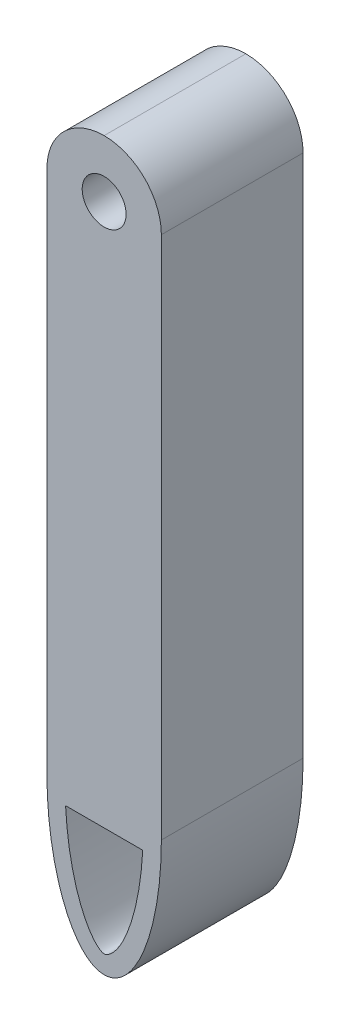
ISO-10303-21;
HEADER;
FILE_DESCRIPTION(('STEP AP214'),'2;1');
FILE_NAME('part.step','',(''),(''),'','','');
FILE_SCHEMA(('AUTOMOTIVE_DESIGN { 1 0 10303 214 1 1 1 1 }'));
ENDSEC;
DATA;
#1=APPLICATION_CONTEXT('core data for automotive mechanical design processes');
#2=APPLICATION_PROTOCOL_DEFINITION('international standard','automotive_design',2000,#1);
#3=PRODUCT_CONTEXT('',#1,'mechanical');
#4=PRODUCT('Part','Part','',(#3));
#5=PRODUCT_RELATED_PRODUCT_CATEGORY('part','',(#4));
#6=PRODUCT_DEFINITION_FORMATION('','',#4);
#7=PRODUCT_DEFINITION_CONTEXT('part definition',#1,'design');
#8=PRODUCT_DEFINITION('design','',#6,#7);
#9=PRODUCT_DEFINITION_SHAPE('','',#8);
#10=(LENGTH_UNIT() NAMED_UNIT(*) SI_UNIT(.MILLI.,.METRE.));
#11=(NAMED_UNIT(*) PLANE_ANGLE_UNIT() SI_UNIT($,.RADIAN.));
#12=(NAMED_UNIT(*) SI_UNIT($,.STERADIAN.) SOLID_ANGLE_UNIT());
#13=UNCERTAINTY_MEASURE_WITH_UNIT(LENGTH_MEASURE(1.E-05),#10,'distance_accuracy_value','');
#14=(GEOMETRIC_REPRESENTATION_CONTEXT(3) GLOBAL_UNCERTAINTY_ASSIGNED_CONTEXT((#13)) GLOBAL_UNIT_ASSIGNED_CONTEXT((#10,
#11,#12)) REPRESENTATION_CONTEXT('',''));
#15=CARTESIAN_POINT('',(0.,0.,0.));
#16=DIRECTION('',(0.,0.,1.));
#17=DIRECTION('',(1.,0.,0.));
#18=AXIS2_PLACEMENT_3D('',#15,#16,#17);
#19=CARTESIAN_POINT('',(0.,0.,49.53));
#20=DIRECTION('',(1.,0.,0.));
#21=DIRECTION('',(0.,0.,-1.));
#22=AXIS2_PLACEMENT_3D('',#19,#20,#21);
#23=PLANE('',#22);
#24=DIRECTION('',(0.,-1.,0.));
#25=VECTOR('',#24,1.);
#26=CARTESIAN_POINT('',(0.,0.,49.53));
#27=LINE('',#26,#25);
#28=CARTESIAN_POINT('',(0.,183.2,49.53));
#29=VERTEX_POINT('',#28);
#30=CARTESIAN_POINT('',(0.,0.,49.53));
#31=VERTEX_POINT('',#30);
#32=EDGE_CURVE('E140',#29,#31,#27,.T.);
#33=ORIENTED_EDGE('',*,*,#32,.F.);
#34=DIRECTION('',(0.,0.,-1.));
#35=VECTOR('',#34,1.);
#36=CARTESIAN_POINT('',(0.,183.2,49.53));
#37=LINE('',#36,#35);
#38=CARTESIAN_POINT('',(0.,183.2,0.));
#39=VERTEX_POINT('',#38);
#40=EDGE_CURVE('E11',#29,#39,#37,.T.);
#41=ORIENTED_EDGE('',*,*,#40,.T.);
#42=DIRECTION('',(0.,-1.,0.));
#43=VECTOR('',#42,1.);
#44=CARTESIAN_POINT('',(0.,0.,0.));
#45=LINE('',#44,#43);
#46=CARTESIAN_POINT('',(0.,0.,0.));
#47=VERTEX_POINT('',#46);
#48=EDGE_CURVE('E146',#39,#47,#45,.T.);
#49=ORIENTED_EDGE('',*,*,#48,.T.);
#50=DIRECTION('',(0.,0.,-1.));
#51=VECTOR('',#50,1.);
#52=CARTESIAN_POINT('',(0.,0.,49.53));
#53=LINE('',#52,#51);
#54=EDGE_CURVE('E153',#31,#47,#53,.T.);
#55=ORIENTED_EDGE('',*,*,#54,.F.);
#56=EDGE_LOOP('',(#33,#41,#49,#55));
#57=FACE_BOUND('',#56,.T.);
#58=ADVANCED_FACE('F33',(#57),#23,.F.);
#59=CARTESIAN_POINT('',(40.,0.,49.53));
#60=DIRECTION('',(-1.,0.,0.));
#61=DIRECTION('',(0.,0.,1.));
#62=AXIS2_PLACEMENT_3D('',#59,#60,#61);
#63=PLANE('',#62);
#64=DIRECTION('',(0.,1.,0.));
#65=VECTOR('',#64,1.);
#66=CARTESIAN_POINT('',(40.,0.,0.));
#67=LINE('',#66,#65);
#68=CARTESIAN_POINT('',(40.,0.,0.));
#69=VERTEX_POINT('',#68);
#70=CARTESIAN_POINT('',(40.,183.2,0.));
#71=VERTEX_POINT('',#70);
#72=EDGE_CURVE('E143',#69,#71,#67,.T.);
#73=ORIENTED_EDGE('',*,*,#72,.T.);
#74=DIRECTION('',(0.,0.,-1.));
#75=VECTOR('',#74,1.);
#76=CARTESIAN_POINT('',(40.,183.2,49.53));
#77=LINE('',#76,#75);
#78=CARTESIAN_POINT('',(40.,183.2,49.53));
#79=VERTEX_POINT('',#78);
#80=EDGE_CURVE('E160',#71,#79,#77,.F.);
#81=ORIENTED_EDGE('',*,*,#80,.T.);
#82=DIRECTION('',(0.,1.,0.));
#83=VECTOR('',#82,1.);
#84=CARTESIAN_POINT('',(40.,0.,49.53));
#85=LINE('',#84,#83);
#86=CARTESIAN_POINT('',(40.,0.,49.53));
#87=VERTEX_POINT('',#86);
#88=EDGE_CURVE('E142',#87,#79,#85,.T.);
#89=ORIENTED_EDGE('',*,*,#88,.F.);
#90=DIRECTION('',(0.,0.,-1.));
#91=VECTOR('',#90,1.);
#92=CARTESIAN_POINT('',(40.,0.,49.53));
#93=LINE('',#92,#91);
#94=EDGE_CURVE('E145',#87,#69,#93,.T.);
#95=ORIENTED_EDGE('',*,*,#94,.T.);
#96=EDGE_LOOP('',(#73,#81,#89,#95));
#97=FACE_BOUND('',#96,.T.);
#98=ADVANCED_FACE('F191',(#97),#63,.F.);
#99=CARTESIAN_POINT('',(0.,0.,49.53));
#100=DIRECTION('',(0.,0.,-1.));
#101=DIRECTION('',(-1.,0.,0.));
#102=AXIS2_PLACEMENT_3D('',#99,#100,#101);
#103=PLANE('',#102);
#104=CARTESIAN_POINT('',(20.,183.2,49.53));
#105=DIRECTION('',(0.,0.,1.));
#106=DIRECTION('',(1.,0.,0.));
#107=AXIS2_PLACEMENT_3D('',#104,#105,#106);
#108=CIRCLE('',#107,7.67);
#109=CARTESIAN_POINT('',(27.67,183.2,49.53));
#110=VERTEX_POINT('',#109);
#111=EDGE_CURVE('E134',#110,#110,#108,.T.);
#112=ORIENTED_EDGE('',*,*,#111,.F.);
#113=EDGE_LOOP('',(#112));
#114=FACE_BOUND('',#113,.T.);
#115=ORIENTED_EDGE('',*,*,#88,.T.);
#116=CARTESIAN_POINT('',(20.,183.2,49.53));
#117=DIRECTION('',(0.,0.,-1.));
#118=DIRECTION('',(-1.,0.,0.));
#119=AXIS2_PLACEMENT_3D('',#116,#117,#118);
#120=CIRCLE('',#119,20.);
#121=CARTESIAN_POINT('',(20.,203.2,49.53));
#122=VERTEX_POINT('',#121);
#123=EDGE_CURVE('E42',#79,#122,#120,.F.);
#124=ORIENTED_EDGE('',*,*,#123,.T.);
#125=CARTESIAN_POINT('',(20.,183.2,49.53));
#126=DIRECTION('',(0.,0.,-1.));
#127=DIRECTION('',(-1.,0.,0.));
#128=AXIS2_PLACEMENT_3D('',#125,#126,#127);
#129=CIRCLE('',#128,20.);
#130=EDGE_CURVE('E53',#122,#29,#129,.F.);
#131=ORIENTED_EDGE('',*,*,#130,.T.);
#132=ORIENTED_EDGE('',*,*,#32,.T.);
#133=CARTESIAN_POINT('',(20.,0.,49.53));
#134=DIRECTION('',(0.,0.,1.));
#135=DIRECTION('',(0.,-1.,0.));
#136=AXIS2_PLACEMENT_3D('',#133,#134,#135);
#137=ELLIPSE('',#136,50.8,20.);
#138=EDGE_CURVE('E129',#31,#87,#137,.T.);
#139=ORIENTED_EDGE('',*,*,#138,.T.);
#140=EDGE_LOOP('',(#115,#124,#131,#132,#139));
#141=FACE_BOUND('',#140,.T.);
#142=DIRECTION('',(-1.,0.,0.));
#143=VECTOR('',#142,1.);
#144=CARTESIAN_POINT('',(6.5150856571903,-6.34999999999998,49.53));
#145=LINE('',#144,#143);
#146=CARTESIAN_POINT('',(33.4849143428097,-6.35,49.53));
#147=VERTEX_POINT('',#146);
#148=CARTESIAN_POINT('',(6.5150856571903,-6.34999999999998,49.53));
#149=VERTEX_POINT('',#148);
#150=EDGE_CURVE('E90',#147,#149,#145,.T.);
#151=ORIENTED_EDGE('',*,*,#150,.F.);
#152=CARTESIAN_POINT('',(6.5150856571903,-6.35,49.53));
#153=CARTESIAN_POINT('',(6.58943121720617,-7.7733346904857,49.53));
#154=CARTESIAN_POINT('',(6.79068891594314,-10.6362074349241,49.53));
#155=CARTESIAN_POINT('',(7.38927478199239,-16.194532881306,49.53));
#156=CARTESIAN_POINT('',(8.49735642454971,-22.8135522253688,49.53));
#157=CARTESIAN_POINT('',(10.3354868403811,-29.8994834621828,49.53));
#158=CARTESIAN_POINT('',(12.5749580304532,-35.8438584830831,49.53));
#159=CARTESIAN_POINT('',(15.0406426287001,-40.3694961107024,49.53));
#160=CARTESIAN_POINT('',(17.4453166031969,-43.2431122046982,49.53));
#161=CARTESIAN_POINT('',(18.9522909082692,-44.2064313386086,49.53));
#162=CARTESIAN_POINT('',(19.6505548057532,-44.4267080366167,49.53));
#163=CARTESIAN_POINT('',(20.,-44.4616459816917,49.53));
#164=CARTESIAN_POINT('',(20.3494451942468,-44.4267080366167,49.53));
#165=CARTESIAN_POINT('',(21.0477090917308,-44.2064313386086,49.53));
#166=CARTESIAN_POINT('',(22.5546833968031,-43.2431122046982,49.53));
#167=CARTESIAN_POINT('',(24.9593573712999,-40.3694961107024,49.53));
#168=CARTESIAN_POINT('',(27.4250419695468,-35.8438584830831,49.53));
#169=CARTESIAN_POINT('',(29.6645131596189,-29.8994834621828,49.53));
#170=CARTESIAN_POINT('',(31.5026435754503,-22.8135522253688,49.53));
#171=CARTESIAN_POINT('',(32.6107252180076,-16.1945328813061,49.53));
#172=CARTESIAN_POINT('',(33.2093110840569,-10.6362074349241,49.53));
#173=CARTESIAN_POINT('',(33.4105687827938,-7.7733346904857,49.53));
#174=CARTESIAN_POINT('',(33.4849143428097,-6.35,49.53));
#175=B_SPLINE_CURVE_WITH_KNOTS('',3,(#152,#153,#154,#155,#156,#157,#158,#159,#160,#161,#162,
#163,#164,#165,#166,#167,#168,#169,#170,#171,#172,#173,#174),.UNSPECIFIED.,.F.,.F.,(4,1,1,1,1,1,
1,1,1,1,1,1,1,1,1,1,1,1,1,1,4),(-1.43889389887241,-1.34896303019289,-1.25903216151336,
-1.07917042415431,-0.899308686795258,-0.719446949436206,-0.539585212077155,-0.359723474718103,
-0.179861737359052,-0.0899308686795258,0.,0.0899308686795258,0.179861737359052,
0.359723474718103,0.539585212077155,0.719446949436206,0.899308686795258,1.07917042415431,
1.25903216151336,1.34896303019289,1.43889389887241),.UNSPECIFIED.);
#176=EDGE_CURVE('E100',#149,#147,#175,.T.);
#177=ORIENTED_EDGE('',*,*,#176,.F.);
#178=EDGE_LOOP('',(#151,#177));
#179=FACE_BOUND('',#178,.T.);
#180=ADVANCED_FACE('F107',(#114,#141,#179),#103,.F.);
#181=CARTESIAN_POINT('',(0.,0.,0.));
#182=DIRECTION('',(0.,0.,-1.));
#183=DIRECTION('',(-1.,0.,0.));
#184=AXIS2_PLACEMENT_3D('',#181,#182,#183);
#185=PLANE('',#184);
#186=CARTESIAN_POINT('',(20.,183.2,0.));
#187=DIRECTION('',(0.,0.,-1.));
#188=DIRECTION('',(-1.,0.,0.));
#189=AXIS2_PLACEMENT_3D('',#186,#187,#188);
#190=CIRCLE('',#189,7.67);
#191=CARTESIAN_POINT('',(27.67,183.2,0.));
#192=VERTEX_POINT('',#191);
#193=EDGE_CURVE('E37',#192,#192,#190,.T.);
#194=ORIENTED_EDGE('',*,*,#193,.F.);
#195=EDGE_LOOP('',(#194));
#196=FACE_BOUND('',#195,.T.);
#197=CARTESIAN_POINT('',(20.,183.2,0.));
#198=DIRECTION('',(0.,0.,-1.));
#199=DIRECTION('',(-1.,0.,0.));
#200=AXIS2_PLACEMENT_3D('',#197,#198,#199);
#201=CIRCLE('',#200,20.);
#202=CARTESIAN_POINT('',(20.,203.2,0.));
#203=VERTEX_POINT('',#202);
#204=EDGE_CURVE('E156',#39,#203,#201,.T.);
#205=ORIENTED_EDGE('',*,*,#204,.T.);
#206=CARTESIAN_POINT('',(20.,183.2,0.));
#207=DIRECTION('',(0.,0.,-1.));
#208=DIRECTION('',(-1.,0.,0.));
#209=AXIS2_PLACEMENT_3D('',#206,#207,#208);
#210=CIRCLE('',#209,20.);
#211=EDGE_CURVE('E158',#203,#71,#210,.T.);
#212=ORIENTED_EDGE('',*,*,#211,.T.);
#213=ORIENTED_EDGE('',*,*,#72,.F.);
#214=CARTESIAN_POINT('',(20.,0.,0.));
#215=DIRECTION('',(0.,0.,1.));
#216=DIRECTION('',(0.,-1.,0.));
#217=AXIS2_PLACEMENT_3D('',#214,#215,#216);
#218=ELLIPSE('',#217,50.8,20.);
#219=EDGE_CURVE('E135',#47,#69,#218,.T.);
#220=ORIENTED_EDGE('',*,*,#219,.F.);
#221=ORIENTED_EDGE('',*,*,#48,.F.);
#222=EDGE_LOOP('',(#205,#212,#213,#220,#221));
#223=FACE_BOUND('',#222,.T.);
#224=CARTESIAN_POINT('',(6.5150856571903,-6.35,0.));
#225=CARTESIAN_POINT('',(6.58943121720617,-7.7733346904857,0.));
#226=CARTESIAN_POINT('',(6.79068891594314,-10.6362074349241,0.));
#227=CARTESIAN_POINT('',(7.38927478199239,-16.194532881306,0.));
#228=CARTESIAN_POINT('',(8.49735642454971,-22.8135522253688,0.));
#229=CARTESIAN_POINT('',(10.3354868403811,-29.8994834621828,0.));
#230=CARTESIAN_POINT('',(12.5749580304532,-35.8438584830831,0.));
#231=CARTESIAN_POINT('',(15.0406426287001,-40.3694961107024,0.));
#232=CARTESIAN_POINT('',(17.4453166031969,-43.2431122046982,0.));
#233=CARTESIAN_POINT('',(18.9522909082692,-44.2064313386086,0.));
#234=CARTESIAN_POINT('',(19.6505548057532,-44.4267080366167,0.));
#235=CARTESIAN_POINT('',(20.,-44.4616459816917,0.));
#236=CARTESIAN_POINT('',(20.3494451942468,-44.4267080366167,0.));
#237=CARTESIAN_POINT('',(21.0477090917308,-44.2064313386086,0.));
#238=CARTESIAN_POINT('',(22.5546833968031,-43.2431122046982,0.));
#239=CARTESIAN_POINT('',(24.9593573712999,-40.3694961107024,0.));
#240=CARTESIAN_POINT('',(27.4250419695468,-35.8438584830831,0.));
#241=CARTESIAN_POINT('',(29.6645131596189,-29.8994834621828,0.));
#242=CARTESIAN_POINT('',(31.5026435754503,-22.8135522253688,0.));
#243=CARTESIAN_POINT('',(32.6107252180076,-16.1945328813061,0.));
#244=CARTESIAN_POINT('',(33.2093110840569,-10.6362074349241,0.));
#245=CARTESIAN_POINT('',(33.4105687827938,-7.7733346904857,0.));
#246=CARTESIAN_POINT('',(33.4849143428097,-6.35,0.));
#247=B_SPLINE_CURVE_WITH_KNOTS('',3,(#224,#225,#226,#227,#228,#229,#230,#231,#232,#233,#234,
#235,#236,#237,#238,#239,#240,#241,#242,#243,#244,#245,#246),.UNSPECIFIED.,.F.,.F.,(4,1,1,1,1,1,
1,1,1,1,1,1,1,1,1,1,1,1,1,1,4),(-1.43889389887241,-1.34896303019289,-1.25903216151336,
-1.07917042415431,-0.899308686795258,-0.719446949436206,-0.539585212077155,-0.359723474718103,
-0.179861737359052,-0.0899308686795258,0.,0.0899308686795258,0.179861737359052,
0.359723474718103,0.539585212077155,0.719446949436206,0.899308686795258,1.07917042415431,
1.25903216151336,1.34896303019289,1.43889389887241),.UNSPECIFIED.);
#248=CARTESIAN_POINT('',(6.5150856571903,-6.34999999999998,0.));
#249=VERTEX_POINT('',#248);
#250=CARTESIAN_POINT('',(33.4849143428097,-6.35,0.));
#251=VERTEX_POINT('',#250);
#252=EDGE_CURVE('E105',#249,#251,#247,.T.);
#253=ORIENTED_EDGE('',*,*,#252,.T.);
#254=DIRECTION('',(-1.,0.,0.));
#255=VECTOR('',#254,1.);
#256=CARTESIAN_POINT('',(6.5150856571903,-6.34999999999998,0.));
#257=LINE('',#256,#255);
#258=EDGE_CURVE('E108',#251,#249,#257,.T.);
#259=ORIENTED_EDGE('',*,*,#258,.T.);
#260=EDGE_LOOP('',(#253,#259));
#261=FACE_BOUND('',#260,.T.);
#262=ADVANCED_FACE('F173',(#196,#223,#261),#185,.T.);
#263=CARTESIAN_POINT('',(20.,183.2,49.53));
#264=DIRECTION('',(0.,0.,-1.));
#265=DIRECTION('',(-1.,0.,0.));
#266=AXIS2_PLACEMENT_3D('',#263,#264,#265);
#267=CYLINDRICAL_SURFACE('',#266,20.);
#268=ORIENTED_EDGE('',*,*,#40,.F.);
#269=ORIENTED_EDGE('',*,*,#130,.F.);
#270=DIRECTION('',(0.,0.,-1.));
#271=VECTOR('',#270,1.);
#272=CARTESIAN_POINT('',(20.,203.2,49.53));
#273=LINE('',#272,#271);
#274=EDGE_CURVE('E148',#203,#122,#273,.F.);
#275=ORIENTED_EDGE('',*,*,#274,.F.);
#276=ORIENTED_EDGE('',*,*,#204,.F.);
#277=EDGE_LOOP('',(#268,#269,#275,#276));
#278=FACE_BOUND('',#277,.T.);
#279=ADVANCED_FACE('F35',(#278),#267,.T.);
#280=CARTESIAN_POINT('',(20.,183.2,49.53));
#281=DIRECTION('',(0.,0.,-1.));
#282=DIRECTION('',(-1.,0.,0.));
#283=AXIS2_PLACEMENT_3D('',#280,#281,#282);
#284=CYLINDRICAL_SURFACE('',#283,20.);
#285=ORIENTED_EDGE('',*,*,#123,.F.);
#286=ORIENTED_EDGE('',*,*,#80,.F.);
#287=ORIENTED_EDGE('',*,*,#211,.F.);
#288=ORIENTED_EDGE('',*,*,#274,.T.);
#289=EDGE_LOOP('',(#285,#286,#287,#288));
#290=FACE_BOUND('',#289,.T.);
#291=ADVANCED_FACE('F189',(#290),#284,.T.);
#292=CARTESIAN_POINT('',(20.,183.2,-1.2E-05));
#293=DIRECTION('',(0.,0.,1.));
#294=DIRECTION('',(1.,0.,0.));
#295=AXIS2_PLACEMENT_3D('',#292,#293,#294);
#296=CYLINDRICAL_SURFACE('',#295,7.67);
#297=CARTESIAN_POINT('',(27.67,183.2,0.));
#298=CARTESIAN_POINT('',(27.67,183.2,0.515937499999999));
#299=CARTESIAN_POINT('',(27.67,183.2,1.031875));
#300=CARTESIAN_POINT('',(27.67,183.2,2.06375));
#301=CARTESIAN_POINT('',(27.67,183.2,2.5796875));
#302=CARTESIAN_POINT('',(27.67,183.2,3.6115625));
#303=CARTESIAN_POINT('',(27.67,183.2,4.1275));
#304=CARTESIAN_POINT('',(27.67,183.2,5.159375));
#305=CARTESIAN_POINT('',(27.67,183.2,5.6753125));
#306=CARTESIAN_POINT('',(27.67,183.2,6.7071875));
#307=CARTESIAN_POINT('',(27.67,183.2,7.223125));
#308=CARTESIAN_POINT('',(27.67,183.2,8.255));
#309=CARTESIAN_POINT('',(27.67,183.2,8.7709375));
#310=CARTESIAN_POINT('',(27.67,183.2,9.8028125));
#311=CARTESIAN_POINT('',(27.67,183.2,10.31875));
#312=CARTESIAN_POINT('',(27.67,183.2,11.350625));
#313=CARTESIAN_POINT('',(27.67,183.2,11.8665625));
#314=CARTESIAN_POINT('',(27.67,183.2,12.8984375));
#315=CARTESIAN_POINT('',(27.67,183.2,13.414375));
#316=CARTESIAN_POINT('',(27.67,183.2,14.44625));
#317=CARTESIAN_POINT('',(27.67,183.2,14.9621875));
#318=CARTESIAN_POINT('',(27.67,183.2,15.9940625));
#319=CARTESIAN_POINT('',(27.67,183.2,16.51));
#320=CARTESIAN_POINT('',(27.67,183.2,17.541875));
#321=CARTESIAN_POINT('',(27.67,183.2,18.0578125));
#322=CARTESIAN_POINT('',(27.67,183.2,19.0896875));
#323=CARTESIAN_POINT('',(27.67,183.2,19.605625));
#324=CARTESIAN_POINT('',(27.67,183.2,20.6375));
#325=CARTESIAN_POINT('',(27.67,183.2,21.1534375));
#326=CARTESIAN_POINT('',(27.67,183.2,22.1853125));
#327=CARTESIAN_POINT('',(27.67,183.2,22.70125));
#328=CARTESIAN_POINT('',(27.67,183.2,23.733125));
#329=CARTESIAN_POINT('',(27.67,183.2,24.2490625));
#330=CARTESIAN_POINT('',(27.67,183.2,25.2809375));
#331=CARTESIAN_POINT('',(27.67,183.2,25.796875));
#332=CARTESIAN_POINT('',(27.67,183.2,26.82875));
#333=CARTESIAN_POINT('',(27.67,183.2,27.3446875));
#334=CARTESIAN_POINT('',(27.67,183.2,28.3765625));
#335=CARTESIAN_POINT('',(27.67,183.2,28.8925));
#336=CARTESIAN_POINT('',(27.67,183.2,29.924375));
#337=CARTESIAN_POINT('',(27.67,183.2,30.4403125));
#338=CARTESIAN_POINT('',(27.67,183.2,31.4721875));
#339=CARTESIAN_POINT('',(27.67,183.2,31.988125));
#340=CARTESIAN_POINT('',(27.67,183.2,33.02));
#341=CARTESIAN_POINT('',(27.67,183.2,33.5359375));
#342=CARTESIAN_POINT('',(27.67,183.2,34.5678125));
#343=CARTESIAN_POINT('',(27.67,183.2,35.08375));
#344=CARTESIAN_POINT('',(27.67,183.2,36.115625));
#345=CARTESIAN_POINT('',(27.67,183.2,36.6315625));
#346=CARTESIAN_POINT('',(27.67,183.2,37.6634375));
#347=CARTESIAN_POINT('',(27.67,183.2,38.179375));
#348=CARTESIAN_POINT('',(27.67,183.2,39.21125));
#349=CARTESIAN_POINT('',(27.67,183.2,39.7271875));
#350=CARTESIAN_POINT('',(27.67,183.2,40.7590625));
#351=CARTESIAN_POINT('',(27.67,183.2,41.275));
#352=CARTESIAN_POINT('',(27.67,183.2,42.306875));
#353=CARTESIAN_POINT('',(27.67,183.2,42.8228125));
#354=CARTESIAN_POINT('',(27.67,183.2,43.8546875));
#355=CARTESIAN_POINT('',(27.67,183.2,44.370625));
#356=CARTESIAN_POINT('',(27.67,183.2,45.4025));
#357=CARTESIAN_POINT('',(27.67,183.2,45.9184375));
#358=CARTESIAN_POINT('',(27.67,183.2,46.9503125));
#359=CARTESIAN_POINT('',(27.67,183.2,47.46625));
#360=CARTESIAN_POINT('',(27.67,183.2,48.498125));
#361=CARTESIAN_POINT('',(27.67,183.2,49.0140625));
#362=CARTESIAN_POINT('',(27.67,183.2,49.53));
#363=B_SPLINE_CURVE_WITH_KNOTS('',3,(#297,#298,#299,#300,#301,#302,#303,#304,#305,#306,#307,
#308,#309,#310,#311,#312,#313,#314,#315,#316,#317,#318,#319,#320,#321,#322,#323,#324,#325,#326,
#327,#328,#329,#330,#331,#332,#333,#334,#335,#336,#337,#338,#339,#340,#341,#342,#343,#344,#345,
#346,#347,#348,#349,#350,#351,#352,#353,#354,#355,#356,#357,#358,#359,#360,#361,#362),
.UNSPECIFIED.,.F.,.F.,(4,2,2,2,2,2,2,2,2,2,2,2,2,2,2,2,2,2,2,2,2,2,2,2,2,2,2,2,2,2,2,2,4),(0.,
1.5478125,3.095625,4.6434375,6.19125,7.7390625,9.286875,10.8346875,12.3825,13.9303125,15.478125,
17.0259375,18.57375,20.1215625,21.669375,23.2171875,24.765,26.3128125,27.860625,29.4084375,
30.95625,32.5040625,34.051875,35.5996875,37.1475,38.6953125,40.243125,41.7909375,43.33875,
44.8865625,46.434375,47.9821875,49.53),.UNSPECIFIED.);
#364=EDGE_CURVE('BSEAM126',#192,#110,#363,.T.);
#365=ORIENTED_EDGE('',*,*,#193,.T.);
#366=ORIENTED_EDGE('',*,*,#111,.T.);
#367=ORIENTED_EDGE('',*,*,#364,.T.);
#368=ORIENTED_EDGE('',*,*,#364,.F.);
#369=EDGE_LOOP('',(#365,#367,#366,#368));
#370=FACE_BOUND('',#369,.T.);
#371=ADVANCED_FACE('F126',(#370),#296,.F.);
#372=DIRECTION('',(0.,0.,-1.));
#373=VECTOR('',#372,1.);
#374=SURFACE_OF_LINEAR_EXTRUSION('',#137,#373);
#375=ORIENTED_EDGE('',*,*,#219,.T.);
#376=ORIENTED_EDGE('',*,*,#94,.F.);
#377=ORIENTED_EDGE('',*,*,#138,.F.);
#378=ORIENTED_EDGE('',*,*,#54,.T.);
#379=EDGE_LOOP('',(#375,#376,#377,#378));
#380=FACE_BOUND('',#379,.T.);
#381=ADVANCED_FACE('F122',(#380),#374,.F.);
#382=DIRECTION('',(0.,0.,-1.));
#383=VECTOR('',#382,1.);
#384=SURFACE_OF_LINEAR_EXTRUSION('',#175,#383);
#385=ORIENTED_EDGE('',*,*,#252,.F.);
#386=DIRECTION('',(0.,0.,-1.));
#387=VECTOR('',#386,1.);
#388=CARTESIAN_POINT('',(6.5150856571903,-6.34999999999998,49.53));
#389=LINE('',#388,#387);
#390=EDGE_CURVE('E93',#149,#249,#389,.T.);
#391=ORIENTED_EDGE('',*,*,#390,.F.);
#392=ORIENTED_EDGE('',*,*,#176,.T.);
#393=DIRECTION('',(0.,0.,-1.));
#394=VECTOR('',#393,1.);
#395=CARTESIAN_POINT('',(33.4849143428097,-6.35,49.53));
#396=LINE('',#395,#394);
#397=EDGE_CURVE('E96',#147,#251,#396,.T.);
#398=ORIENTED_EDGE('',*,*,#397,.T.);
#399=EDGE_LOOP('',(#385,#391,#392,#398));
#400=FACE_BOUND('',#399,.T.);
#401=ADVANCED_FACE('F103',(#400),#384,.T.);
#402=CARTESIAN_POINT('',(6.5150856571903,-6.34999999999998,49.53));
#403=DIRECTION('',(0.,-1.,0.));
#404=DIRECTION('',(1.,0.,0.));
#405=AXIS2_PLACEMENT_3D('',#402,#403,#404);
#406=PLANE('',#405);
#407=ORIENTED_EDGE('',*,*,#258,.F.);
#408=ORIENTED_EDGE('',*,*,#397,.F.);
#409=ORIENTED_EDGE('',*,*,#150,.T.);
#410=ORIENTED_EDGE('',*,*,#390,.T.);
#411=EDGE_LOOP('',(#407,#408,#409,#410));
#412=FACE_BOUND('',#411,.T.);
#413=ADVANCED_FACE('F92',(#412),#406,.T.);
#414=CLOSED_SHELL('',(#58,#98,#180,#262,#279,#291,#371,#381,#401,#413));
#415=MANIFOLD_SOLID_BREP('B2',#414);
#416=ADVANCED_BREP_SHAPE_REPRESENTATION('',(#18,#415),#14);
#417=SHAPE_DEFINITION_REPRESENTATION(#9,#416);
ENDSEC;
END-ISO-10303-21;
